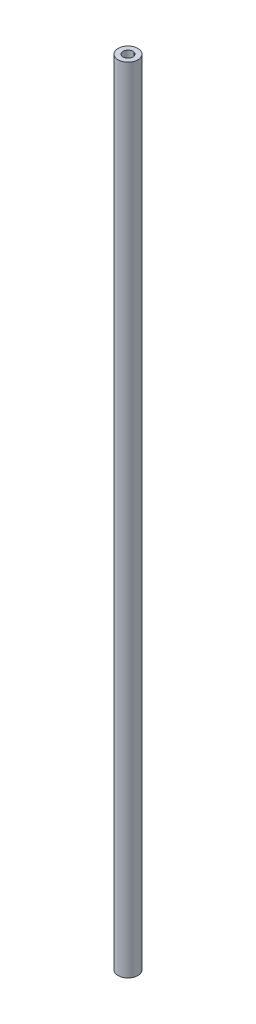
ISO-10303-21;
HEADER;
FILE_DESCRIPTION(('STEP AP214'),'2;1');
FILE_NAME('part.step','',(''),(''),'','','');
FILE_SCHEMA(('AUTOMOTIVE_DESIGN { 1 0 10303 214 1 1 1 1 }'));
ENDSEC;
DATA;
#1=APPLICATION_CONTEXT('core data for automotive mechanical design processes');
#2=APPLICATION_PROTOCOL_DEFINITION('international standard','automotive_design',2000,#1);
#3=PRODUCT_CONTEXT('',#1,'mechanical');
#4=PRODUCT('Part','Part','',(#3));
#5=PRODUCT_RELATED_PRODUCT_CATEGORY('part','',(#4));
#6=PRODUCT_DEFINITION_FORMATION('','',#4);
#7=PRODUCT_DEFINITION_CONTEXT('part definition',#1,'design');
#8=PRODUCT_DEFINITION('design','',#6,#7);
#9=PRODUCT_DEFINITION_SHAPE('','',#8);
#10=(LENGTH_UNIT() NAMED_UNIT(*) SI_UNIT(.MILLI.,.METRE.));
#11=(NAMED_UNIT(*) PLANE_ANGLE_UNIT() SI_UNIT($,.RADIAN.));
#12=(NAMED_UNIT(*) SI_UNIT($,.STERADIAN.) SOLID_ANGLE_UNIT());
#13=UNCERTAINTY_MEASURE_WITH_UNIT(LENGTH_MEASURE(1.E-05),#10,'distance_accuracy_value','');
#14=(GEOMETRIC_REPRESENTATION_CONTEXT(3) GLOBAL_UNCERTAINTY_ASSIGNED_CONTEXT((#13)) GLOBAL_UNIT_ASSIGNED_CONTEXT((#10,
#11,#12)) REPRESENTATION_CONTEXT('',''));
#15=CARTESIAN_POINT('',(0.,0.,0.));
#16=DIRECTION('',(0.,0.,1.));
#17=DIRECTION('',(1.,0.,0.));
#18=AXIS2_PLACEMENT_3D('',#15,#16,#17);
#19=CARTESIAN_POINT('',(0.,101.6,0.));
#20=DIRECTION('',(0.,1.,0.));
#21=DIRECTION('',(0.,0.,1.));
#22=AXIS2_PLACEMENT_3D('',#19,#20,#21);
#23=PLANE('',#22);
#24=CARTESIAN_POINT('',(0.,101.6,0.));
#25=DIRECTION('',(0.,1.,0.));
#26=DIRECTION('',(0.,0.,1.));
#27=AXIS2_PLACEMENT_3D('',#24,#25,#26);
#28=CIRCLE('',#27,1.27);
#29=CARTESIAN_POINT('',(0.,101.6,1.27));
#30=VERTEX_POINT('',#29);
#31=EDGE_CURVE('E10',#30,#30,#28,.T.);
#32=ORIENTED_EDGE('',*,*,#31,.T.);
#33=EDGE_LOOP('',(#32));
#34=FACE_BOUND('',#33,.T.);
#35=CARTESIAN_POINT('',(0.,101.6,0.));
#36=DIRECTION('',(0.,1.,0.));
#37=DIRECTION('',(0.,0.,1.));
#38=AXIS2_PLACEMENT_3D('',#35,#36,#37);
#39=CIRCLE('',#38,0.635);
#40=CARTESIAN_POINT('',(0.,101.6,0.635));
#41=VERTEX_POINT('',#40);
#42=EDGE_CURVE('E43',#41,#41,#39,.T.);
#43=ORIENTED_EDGE('',*,*,#42,.F.);
#44=EDGE_LOOP('',(#43));
#45=FACE_BOUND('',#44,.T.);
#46=ADVANCED_FACE('F32',(#34,#45),#23,.T.);
#47=CARTESIAN_POINT('',(0.,0.,0.));
#48=DIRECTION('',(0.,1.,0.));
#49=DIRECTION('',(0.,0.,1.));
#50=AXIS2_PLACEMENT_3D('',#47,#48,#49);
#51=PLANE('',#50);
#52=CARTESIAN_POINT('',(0.,0.,0.));
#53=DIRECTION('',(0.,1.,0.));
#54=DIRECTION('',(0.,0.,1.));
#55=AXIS2_PLACEMENT_3D('',#52,#53,#54);
#56=CIRCLE('',#55,1.27);
#57=CARTESIAN_POINT('',(0.,0.,1.27));
#58=VERTEX_POINT('',#57);
#59=EDGE_CURVE('E36',#58,#58,#56,.T.);
#60=ORIENTED_EDGE('',*,*,#59,.F.);
#61=EDGE_LOOP('',(#60));
#62=FACE_BOUND('',#61,.T.);
#63=CARTESIAN_POINT('',(0.,0.,0.));
#64=DIRECTION('',(0.,1.,0.));
#65=DIRECTION('',(0.,0.,1.));
#66=AXIS2_PLACEMENT_3D('',#63,#64,#65);
#67=CIRCLE('',#66,0.635);
#68=CARTESIAN_POINT('',(0.,0.,0.635));
#69=VERTEX_POINT('',#68);
#70=EDGE_CURVE('E45',#69,#69,#67,.T.);
#71=ORIENTED_EDGE('',*,*,#70,.T.);
#72=EDGE_LOOP('',(#71));
#73=FACE_BOUND('',#72,.T.);
#74=ADVANCED_FACE('F55',(#62,#73),#51,.F.);
#75=CARTESIAN_POINT('',(0.,101.6,0.));
#76=DIRECTION('',(0.,-1.,0.));
#77=DIRECTION('',(0.,0.,-1.));
#78=AXIS2_PLACEMENT_3D('',#75,#76,#77);
#79=CYLINDRICAL_SURFACE('',#78,1.27);
#80=ORIENTED_EDGE('',*,*,#31,.F.);
#81=EDGE_LOOP('',(#80));
#82=FACE_BOUND('',#81,.T.);
#83=ORIENTED_EDGE('',*,*,#59,.T.);
#84=EDGE_LOOP('',(#83));
#85=FACE_BOUND('',#84,.T.);
#86=ADVANCED_FACE('F34',(#82,#85),#79,.T.);
#87=CARTESIAN_POINT('',(0.,101.6,0.));
#88=DIRECTION('',(0.,-1.,0.));
#89=DIRECTION('',(0.,0.,-1.));
#90=AXIS2_PLACEMENT_3D('',#87,#88,#89);
#91=CYLINDRICAL_SURFACE('',#90,0.635);
#92=ORIENTED_EDGE('',*,*,#42,.T.);
#93=EDGE_LOOP('',(#92));
#94=FACE_BOUND('',#93,.T.);
#95=ORIENTED_EDGE('',*,*,#70,.F.);
#96=EDGE_LOOP('',(#95));
#97=FACE_BOUND('',#96,.T.);
#98=ADVANCED_FACE('F51',(#94,#97),#91,.F.);
#99=CLOSED_SHELL('',(#46,#74,#86,#98));
#100=MANIFOLD_SOLID_BREP('B2',#99);
#101=ADVANCED_BREP_SHAPE_REPRESENTATION('',(#18,#100),#14);
#102=SHAPE_DEFINITION_REPRESENTATION(#9,#101);
ENDSEC;
END-ISO-10303-21;
